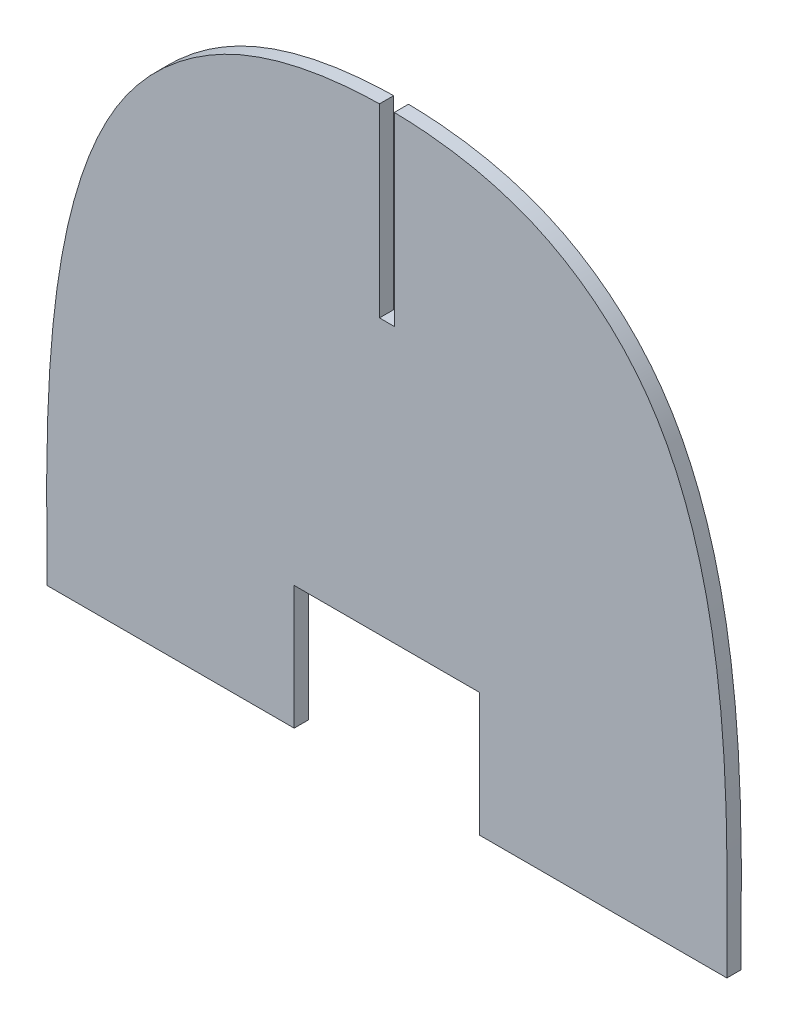
ISO-10303-21;
HEADER;
FILE_DESCRIPTION(('STEP AP214'),'2;1');
FILE_NAME('part.step','',(''),(''),'','','');
FILE_SCHEMA(('AUTOMOTIVE_DESIGN { 1 0 10303 214 1 1 1 1 }'));
ENDSEC;
DATA;
#1=APPLICATION_CONTEXT('core data for automotive mechanical design processes');
#2=APPLICATION_PROTOCOL_DEFINITION('international standard','automotive_design',2000,#1);
#3=PRODUCT_CONTEXT('',#1,'mechanical');
#4=PRODUCT('Part','Part','',(#3));
#5=PRODUCT_RELATED_PRODUCT_CATEGORY('part','',(#4));
#6=PRODUCT_DEFINITION_FORMATION('','',#4);
#7=PRODUCT_DEFINITION_CONTEXT('part definition',#1,'design');
#8=PRODUCT_DEFINITION('design','',#6,#7);
#9=PRODUCT_DEFINITION_SHAPE('','',#8);
#10=(LENGTH_UNIT() NAMED_UNIT(*) SI_UNIT(.MILLI.,.METRE.));
#11=(NAMED_UNIT(*) PLANE_ANGLE_UNIT() SI_UNIT($,.RADIAN.));
#12=(NAMED_UNIT(*) SI_UNIT($,.STERADIAN.) SOLID_ANGLE_UNIT());
#13=UNCERTAINTY_MEASURE_WITH_UNIT(LENGTH_MEASURE(1.E-05),#10,'distance_accuracy_value','');
#14=(GEOMETRIC_REPRESENTATION_CONTEXT(3) GLOBAL_UNCERTAINTY_ASSIGNED_CONTEXT((#13)) GLOBAL_UNIT_ASSIGNED_CONTEXT((#10,
#11,#12)) REPRESENTATION_CONTEXT('',''));
#15=CARTESIAN_POINT('',(0.,0.,0.));
#16=DIRECTION('',(0.,0.,1.));
#17=DIRECTION('',(1.,0.,0.));
#18=AXIS2_PLACEMENT_3D('',#15,#16,#17);
#19=CARTESIAN_POINT('',(139.7,39.6875,5.842));
#20=CARTESIAN_POINT('',(139.7,82.9965852670733,5.842));
#21=CARTESIAN_POINT('',(142.840222691212,163.904467186609,5.842));
#22=CARTESIAN_POINT('',(104.060068028556,240.096596199031,5.842));
#23=CARTESIAN_POINT('',(60.712106624686,273.845268019154,5.842));
#24=CARTESIAN_POINT('',(19.7787529671966,279.4,5.842));
#25=CARTESIAN_POINT('',(0.,279.4,5.842));
#26=B_SPLINE_CURVE_WITH_KNOTS('',3,(#19,#20,#21,#22,#23,#24,#25),.UNSPECIFIED.,.F.,.F.,(4,1,1,1,
4),(0.,0.502836743683405,0.632798024999843,0.805339170019215,1.),.UNSPECIFIED.);
#27=DIRECTION('',(0.,0.,-1.));
#28=VECTOR('',#27,1.);
#29=SURFACE_OF_LINEAR_EXTRUSION('',#26,#28);
#30=CARTESIAN_POINT('',(139.7,39.6875,0.));
#31=CARTESIAN_POINT('',(139.7,82.9965852670733,0.));
#32=CARTESIAN_POINT('',(142.840222691212,163.904467186609,0.));
#33=CARTESIAN_POINT('',(104.060068028556,240.096596199031,0.));
#34=CARTESIAN_POINT('',(60.712106624686,273.845268019154,0.));
#35=CARTESIAN_POINT('',(19.7787529671966,279.4,0.));
#36=CARTESIAN_POINT('',(0.,279.4,0.));
#37=B_SPLINE_CURVE_WITH_KNOTS('',3,(#30,#31,#32,#33,#34,#35,#36),.UNSPECIFIED.,.F.,.F.,(4,1,1,1,
4),(0.,0.502836743683405,0.632798024999843,0.805339170019215,1.),.UNSPECIFIED.);
#38=CARTESIAN_POINT('',(139.7,39.6875,0.));
#39=VERTEX_POINT('',#38);
#40=CARTESIAN_POINT('',(3.048,279.376576543208,0.));
#41=VERTEX_POINT('',#40);
#42=EDGE_CURVE('E210',#39,#41,#37,.T.);
#43=ORIENTED_EDGE('',*,*,#42,.T.);
#44=DIRECTION('',(0.,0.,-1.));
#45=VECTOR('',#44,1.);
#46=CARTESIAN_POINT('',(3.04800000000001,279.376576543359,5.842));
#47=LINE('',#46,#45);
#48=CARTESIAN_POINT('',(3.048,279.376576543208,5.842));
#49=VERTEX_POINT('',#48);
#50=EDGE_CURVE('E223',#41,#49,#47,.F.);
#51=ORIENTED_EDGE('',*,*,#50,.T.);
#52=CARTESIAN_POINT('',(139.7,39.6875,5.842));
#53=VERTEX_POINT('',#52);
#54=EDGE_CURVE('E202',#53,#49,#26,.T.);
#55=ORIENTED_EDGE('',*,*,#54,.F.);
#56=DIRECTION('',(0.,0.,-1.));
#57=VECTOR('',#56,1.);
#58=CARTESIAN_POINT('',(139.7,39.6875,5.842));
#59=LINE('',#58,#57);
#60=EDGE_CURVE('E11',#53,#39,#59,.T.);
#61=ORIENTED_EDGE('',*,*,#60,.T.);
#62=EDGE_LOOP('',(#43,#51,#55,#61));
#63=FACE_BOUND('',#62,.T.);
#64=ADVANCED_FACE('F33',(#63),#29,.F.);
#65=CARTESIAN_POINT('',(139.7,39.6875,5.842));
#66=DIRECTION('',(0.,1.,0.));
#67=DIRECTION('',(-1.,0.,0.));
#68=AXIS2_PLACEMENT_3D('',#65,#66,#67);
#69=PLANE('',#68);
#70=DIRECTION('',(1.,0.,0.));
#71=VECTOR('',#70,1.);
#72=CARTESIAN_POINT('',(139.7,39.6875,5.842));
#73=LINE('',#72,#71);
#74=CARTESIAN_POINT('',(38.1,39.6875,5.842));
#75=VERTEX_POINT('',#74);
#76=EDGE_CURVE('E41',#75,#53,#73,.T.);
#77=ORIENTED_EDGE('',*,*,#76,.F.);
#78=DIRECTION('',(0.,0.,1.));
#79=VECTOR('',#78,1.);
#80=CARTESIAN_POINT('',(38.1,39.6875,0.));
#81=LINE('',#80,#79);
#82=CARTESIAN_POINT('',(38.1,39.6875,0.));
#83=VERTEX_POINT('',#82);
#84=EDGE_CURVE('E198',#83,#75,#81,.T.);
#85=ORIENTED_EDGE('',*,*,#84,.F.);
#86=DIRECTION('',(1.,0.,0.));
#87=VECTOR('',#86,1.);
#88=CARTESIAN_POINT('',(139.7,39.6875,0.));
#89=LINE('',#88,#87);
#90=EDGE_CURVE('E204',#83,#39,#89,.T.);
#91=ORIENTED_EDGE('',*,*,#90,.T.);
#92=ORIENTED_EDGE('',*,*,#60,.F.);
#93=EDGE_LOOP('',(#77,#85,#91,#92));
#94=FACE_BOUND('',#93,.T.);
#95=ADVANCED_FACE('F186',(#94),#69,.F.);
#96=CARTESIAN_POINT('',(123.782068252662,197.429796257502,5.842));
#97=DIRECTION('',(0.,0.,1.));
#98=DIRECTION('',(1.,0.,0.));
#99=AXIS2_PLACEMENT_3D('',#96,#97,#98);
#100=PLANE('',#99);
#101=DIRECTION('',(0.,1.,0.));
#102=VECTOR('',#101,1.);
#103=CARTESIAN_POINT('',(3.048,279.4,5.842));
#104=LINE('',#103,#102);
#105=CARTESIAN_POINT('',(3.04800000000001,203.2,5.842));
#106=VERTEX_POINT('',#105);
#107=EDGE_CURVE('E118',#106,#49,#104,.T.);
#108=ORIENTED_EDGE('',*,*,#107,.F.);
#109=DIRECTION('',(1.,0.,0.));
#110=VECTOR('',#109,1.);
#111=CARTESIAN_POINT('',(0.,203.2,5.842));
#112=LINE('',#111,#110);
#113=CARTESIAN_POINT('',(-3.04800000000001,203.2,5.842));
#114=VERTEX_POINT('',#113);
#115=EDGE_CURVE('E110',#114,#106,#112,.T.);
#116=ORIENTED_EDGE('',*,*,#115,.F.);
#117=DIRECTION('',(0.,1.,0.));
#118=VECTOR('',#117,1.);
#119=CARTESIAN_POINT('',(-3.048,279.4,5.842));
#120=LINE('',#119,#118);
#121=CARTESIAN_POINT('',(-3.048,279.376576543208,5.842));
#122=VERTEX_POINT('',#121);
#123=EDGE_CURVE('E115',#114,#122,#120,.T.);
#124=ORIENTED_EDGE('',*,*,#123,.T.);
#125=CARTESIAN_POINT('',(-139.7,39.6875,5.842));
#126=CARTESIAN_POINT('',(-139.7,82.9965852670733,5.842));
#127=CARTESIAN_POINT('',(-142.840222691212,163.904467186609,5.842));
#128=CARTESIAN_POINT('',(-104.060068028556,240.096596199031,5.842));
#129=CARTESIAN_POINT('',(-60.712106624686,273.845268019154,5.842));
#130=CARTESIAN_POINT('',(-19.7787529671966,279.4,5.842));
#131=CARTESIAN_POINT('',(0.,279.4,5.842));
#132=B_SPLINE_CURVE_WITH_KNOTS('',3,(#125,#126,#127,#128,#129,#130,#131),.UNSPECIFIED.,.F.,.F.,
(4,1,1,1,4),(0.,0.502836743683405,0.632798024999843,0.805339170019215,1.),.UNSPECIFIED.);
#133=CARTESIAN_POINT('',(-139.7,39.6875,5.842));
#134=VERTEX_POINT('',#133);
#135=EDGE_CURVE('E152',#134,#122,#132,.T.);
#136=ORIENTED_EDGE('',*,*,#135,.F.);
#137=DIRECTION('',(-1.,0.,0.));
#138=VECTOR('',#137,1.);
#139=CARTESIAN_POINT('',(-139.7,39.6875,5.842));
#140=LINE('',#139,#138);
#141=CARTESIAN_POINT('',(-38.1,39.6875,5.842));
#142=VERTEX_POINT('',#141);
#143=EDGE_CURVE('E157',#142,#134,#140,.T.);
#144=ORIENTED_EDGE('',*,*,#143,.F.);
#145=DIRECTION('',(0.,1.,0.));
#146=VECTOR('',#145,1.);
#147=CARTESIAN_POINT('',(-38.1,39.6875,5.842));
#148=LINE('',#147,#146);
#149=CARTESIAN_POINT('',(-38.1,90.4875,5.842));
#150=VERTEX_POINT('',#149);
#151=EDGE_CURVE('E139',#142,#150,#148,.T.);
#152=ORIENTED_EDGE('',*,*,#151,.T.);
#153=DIRECTION('',(-1.,0.,0.));
#154=VECTOR('',#153,1.);
#155=CARTESIAN_POINT('',(0.,90.4875,5.842));
#156=LINE('',#155,#154);
#157=CARTESIAN_POINT('',(38.1,90.4875,5.842));
#158=VERTEX_POINT('',#157);
#159=EDGE_CURVE('E233',#158,#150,#156,.T.);
#160=ORIENTED_EDGE('',*,*,#159,.F.);
#161=DIRECTION('',(0.,1.,0.));
#162=VECTOR('',#161,1.);
#163=CARTESIAN_POINT('',(38.1,39.6875,5.842));
#164=LINE('',#163,#162);
#165=EDGE_CURVE('E230',#75,#158,#164,.T.);
#166=ORIENTED_EDGE('',*,*,#165,.F.);
#167=ORIENTED_EDGE('',*,*,#76,.T.);
#168=ORIENTED_EDGE('',*,*,#54,.T.);
#169=EDGE_LOOP('',(#108,#116,#124,#136,#144,#152,#160,#166,#167,#168));
#170=FACE_BOUND('',#169,.T.);
#171=ADVANCED_FACE('F112',(#170),#100,.T.);
#172=CARTESIAN_POINT('',(123.782068252662,197.429796257502,0.));
#173=DIRECTION('',(0.,0.,1.));
#174=DIRECTION('',(1.,0.,0.));
#175=AXIS2_PLACEMENT_3D('',#172,#173,#174);
#176=PLANE('',#175);
#177=DIRECTION('',(1.,0.,0.));
#178=VECTOR('',#177,1.);
#179=CARTESIAN_POINT('',(0.,203.2,0.));
#180=LINE('',#179,#178);
#181=CARTESIAN_POINT('',(-3.04800000000001,203.2,0.));
#182=VERTEX_POINT('',#181);
#183=CARTESIAN_POINT('',(3.04800000000001,203.2,0.));
#184=VERTEX_POINT('',#183);
#185=EDGE_CURVE('E126',#182,#184,#180,.T.);
#186=ORIENTED_EDGE('',*,*,#185,.T.);
#187=DIRECTION('',(0.,1.,0.));
#188=VECTOR('',#187,1.);
#189=CARTESIAN_POINT('',(3.048,279.4,0.));
#190=LINE('',#189,#188);
#191=EDGE_CURVE('E48',#184,#41,#190,.T.);
#192=ORIENTED_EDGE('',*,*,#191,.T.);
#193=ORIENTED_EDGE('',*,*,#42,.F.);
#194=ORIENTED_EDGE('',*,*,#90,.F.);
#195=DIRECTION('',(0.,1.,0.));
#196=VECTOR('',#195,1.);
#197=CARTESIAN_POINT('',(38.1,39.6875,0.));
#198=LINE('',#197,#196);
#199=CARTESIAN_POINT('',(38.1,90.4875,0.));
#200=VERTEX_POINT('',#199);
#201=EDGE_CURVE('E231',#83,#200,#198,.T.);
#202=ORIENTED_EDGE('',*,*,#201,.T.);
#203=DIRECTION('',(-1.,0.,0.));
#204=VECTOR('',#203,1.);
#205=CARTESIAN_POINT('',(0.,90.4875,0.));
#206=LINE('',#205,#204);
#207=CARTESIAN_POINT('',(-38.1,90.4875,0.));
#208=VERTEX_POINT('',#207);
#209=EDGE_CURVE('E56',#200,#208,#206,.T.);
#210=ORIENTED_EDGE('',*,*,#209,.T.);
#211=DIRECTION('',(0.,1.,0.));
#212=VECTOR('',#211,1.);
#213=CARTESIAN_POINT('',(-38.1,39.6875,0.));
#214=LINE('',#213,#212);
#215=CARTESIAN_POINT('',(-38.1,39.6875,0.));
#216=VERTEX_POINT('',#215);
#217=EDGE_CURVE('E140',#216,#208,#214,.T.);
#218=ORIENTED_EDGE('',*,*,#217,.F.);
#219=DIRECTION('',(-1.,0.,0.));
#220=VECTOR('',#219,1.);
#221=CARTESIAN_POINT('',(-139.7,39.6875,0.));
#222=LINE('',#221,#220);
#223=CARTESIAN_POINT('',(-139.7,39.6875,0.));
#224=VERTEX_POINT('',#223);
#225=EDGE_CURVE('E158',#216,#224,#222,.T.);
#226=ORIENTED_EDGE('',*,*,#225,.T.);
#227=CARTESIAN_POINT('',(-139.7,39.6875,0.));
#228=CARTESIAN_POINT('',(-139.7,82.9965852670733,0.));
#229=CARTESIAN_POINT('',(-142.840222691212,163.904467186609,0.));
#230=CARTESIAN_POINT('',(-104.060068028556,240.096596199031,0.));
#231=CARTESIAN_POINT('',(-60.712106624686,273.845268019154,0.));
#232=CARTESIAN_POINT('',(-19.7787529671966,279.4,0.));
#233=CARTESIAN_POINT('',(0.,279.4,0.));
#234=B_SPLINE_CURVE_WITH_KNOTS('',3,(#227,#228,#229,#230,#231,#232,#233),.UNSPECIFIED.,.F.,.F.,
(4,1,1,1,4),(0.,0.502836743683405,0.632798024999843,0.805339170019215,1.),.UNSPECIFIED.);
#235=CARTESIAN_POINT('',(-3.048,279.376576543208,0.));
#236=VERTEX_POINT('',#235);
#237=EDGE_CURVE('E149',#224,#236,#234,.T.);
#238=ORIENTED_EDGE('',*,*,#237,.T.);
#239=DIRECTION('',(0.,1.,0.));
#240=VECTOR('',#239,1.);
#241=CARTESIAN_POINT('',(-3.048,279.4,0.));
#242=LINE('',#241,#240);
#243=EDGE_CURVE('E130',#182,#236,#242,.T.);
#244=ORIENTED_EDGE('',*,*,#243,.F.);
#245=EDGE_LOOP('',(#186,#192,#193,#194,#202,#210,#218,#226,#238,#244));
#246=FACE_BOUND('',#245,.T.);
#247=ADVANCED_FACE('F180',(#246),#176,.F.);
#248=CARTESIAN_POINT('',(0.,90.4875,0.));
#249=DIRECTION('',(0.,1.,0.));
#250=DIRECTION('',(0.,0.,1.));
#251=AXIS2_PLACEMENT_3D('',#248,#249,#250);
#252=PLANE('',#251);
#253=ORIENTED_EDGE('',*,*,#159,.T.);
#254=DIRECTION('',(0.,0.,1.));
#255=VECTOR('',#254,1.);
#256=CARTESIAN_POINT('',(-38.1,90.4875,0.));
#257=LINE('',#256,#255);
#258=EDGE_CURVE('E146',#208,#150,#257,.T.);
#259=ORIENTED_EDGE('',*,*,#258,.F.);
#260=ORIENTED_EDGE('',*,*,#209,.F.);
#261=DIRECTION('',(0.,0.,1.));
#262=VECTOR('',#261,1.);
#263=CARTESIAN_POINT('',(38.1,90.4875,0.));
#264=LINE('',#263,#262);
#265=EDGE_CURVE('E214',#200,#158,#264,.T.);
#266=ORIENTED_EDGE('',*,*,#265,.T.);
#267=EDGE_LOOP('',(#253,#259,#260,#266));
#268=FACE_BOUND('',#267,.T.);
#269=ADVANCED_FACE('F177',(#268),#252,.F.);
#270=CARTESIAN_POINT('',(38.1,39.6875,0.));
#271=DIRECTION('',(1.,0.,0.));
#272=DIRECTION('',(0.,0.,-1.));
#273=AXIS2_PLACEMENT_3D('',#270,#271,#272);
#274=PLANE('',#273);
#275=ORIENTED_EDGE('',*,*,#165,.T.);
#276=ORIENTED_EDGE('',*,*,#265,.F.);
#277=ORIENTED_EDGE('',*,*,#201,.F.);
#278=ORIENTED_EDGE('',*,*,#84,.T.);
#279=EDGE_LOOP('',(#275,#276,#277,#278));
#280=FACE_BOUND('',#279,.T.);
#281=ADVANCED_FACE('F174',(#280),#274,.F.);
#282=CARTESIAN_POINT('',(3.048,279.4,0.));
#283=DIRECTION('',(1.,0.,0.));
#284=DIRECTION('',(0.,1.,0.));
#285=AXIS2_PLACEMENT_3D('',#282,#283,#284);
#286=PLANE('',#285);
#287=ORIENTED_EDGE('',*,*,#191,.F.);
#288=DIRECTION('',(0.,0.,1.));
#289=VECTOR('',#288,1.);
#290=CARTESIAN_POINT('',(3.04800000000001,203.2,0.));
#291=LINE('',#290,#289);
#292=EDGE_CURVE('E221',#184,#106,#291,.T.);
#293=ORIENTED_EDGE('',*,*,#292,.T.);
#294=ORIENTED_EDGE('',*,*,#107,.T.);
#295=ORIENTED_EDGE('',*,*,#50,.F.);
#296=EDGE_LOOP('',(#287,#293,#294,#295));
#297=FACE_BOUND('',#296,.T.);
#298=ADVANCED_FACE('F171',(#297),#286,.F.);
#299=CARTESIAN_POINT('',(0.,203.2,0.));
#300=DIRECTION('',(0.,-1.,0.));
#301=DIRECTION('',(0.,0.,-1.));
#302=AXIS2_PLACEMENT_3D('',#299,#300,#301);
#303=PLANE('',#302);
#304=ORIENTED_EDGE('',*,*,#115,.T.);
#305=ORIENTED_EDGE('',*,*,#292,.F.);
#306=ORIENTED_EDGE('',*,*,#185,.F.);
#307=DIRECTION('',(0.,0.,1.));
#308=VECTOR('',#307,1.);
#309=CARTESIAN_POINT('',(-3.04800000000001,203.2,0.));
#310=LINE('',#309,#308);
#311=EDGE_CURVE('E123',#182,#114,#310,.T.);
#312=ORIENTED_EDGE('',*,*,#311,.T.);
#313=EDGE_LOOP('',(#304,#305,#306,#312));
#314=FACE_BOUND('',#313,.T.);
#315=ADVANCED_FACE('F124',(#314),#303,.F.);
#316=DIRECTION('',(0.,0.,-1.));
#317=VECTOR('',#316,1.);
#318=SURFACE_OF_LINEAR_EXTRUSION('',#132,#317);
#319=ORIENTED_EDGE('',*,*,#237,.F.);
#320=DIRECTION('',(0.,0.,-1.));
#321=VECTOR('',#320,1.);
#322=CARTESIAN_POINT('',(-139.7,39.6875,5.842));
#323=LINE('',#322,#321);
#324=EDGE_CURVE('E120',#134,#224,#323,.T.);
#325=ORIENTED_EDGE('',*,*,#324,.F.);
#326=ORIENTED_EDGE('',*,*,#135,.T.);
#327=DIRECTION('',(0.,0.,-1.));
#328=VECTOR('',#327,1.);
#329=CARTESIAN_POINT('',(-3.04800000000001,279.376576543359,5.842));
#330=LINE('',#329,#328);
#331=EDGE_CURVE('E129',#236,#122,#330,.F.);
#332=ORIENTED_EDGE('',*,*,#331,.F.);
#333=EDGE_LOOP('',(#319,#325,#326,#332));
#334=FACE_BOUND('',#333,.T.);
#335=ADVANCED_FACE('F164',(#334),#318,.T.);
#336=CARTESIAN_POINT('',(-139.7,39.6875,5.842));
#337=DIRECTION('',(0.,1.,0.));
#338=DIRECTION('',(1.,0.,0.));
#339=AXIS2_PLACEMENT_3D('',#336,#337,#338);
#340=PLANE('',#339);
#341=ORIENTED_EDGE('',*,*,#143,.T.);
#342=ORIENTED_EDGE('',*,*,#324,.T.);
#343=ORIENTED_EDGE('',*,*,#225,.F.);
#344=DIRECTION('',(0.,0.,1.));
#345=VECTOR('',#344,1.);
#346=CARTESIAN_POINT('',(-38.1,39.6875,0.));
#347=LINE('',#346,#345);
#348=EDGE_CURVE('E143',#216,#142,#347,.T.);
#349=ORIENTED_EDGE('',*,*,#348,.T.);
#350=EDGE_LOOP('',(#341,#342,#343,#349));
#351=FACE_BOUND('',#350,.T.);
#352=ADVANCED_FACE('F168',(#351),#340,.F.);
#353=CARTESIAN_POINT('',(-38.1,39.6875,0.));
#354=DIRECTION('',(-1.,0.,0.));
#355=DIRECTION('',(0.,0.,-1.));
#356=AXIS2_PLACEMENT_3D('',#353,#354,#355);
#357=PLANE('',#356);
#358=ORIENTED_EDGE('',*,*,#151,.F.);
#359=ORIENTED_EDGE('',*,*,#348,.F.);
#360=ORIENTED_EDGE('',*,*,#217,.T.);
#361=ORIENTED_EDGE('',*,*,#258,.T.);
#362=EDGE_LOOP('',(#358,#359,#360,#361));
#363=FACE_BOUND('',#362,.T.);
#364=ADVANCED_FACE('F241',(#363),#357,.F.);
#365=CARTESIAN_POINT('',(-3.048,279.4,0.));
#366=DIRECTION('',(-1.,0.,0.));
#367=DIRECTION('',(0.,1.,0.));
#368=AXIS2_PLACEMENT_3D('',#365,#366,#367);
#369=PLANE('',#368);
#370=ORIENTED_EDGE('',*,*,#243,.T.);
#371=ORIENTED_EDGE('',*,*,#331,.T.);
#372=ORIENTED_EDGE('',*,*,#123,.F.);
#373=ORIENTED_EDGE('',*,*,#311,.F.);
#374=EDGE_LOOP('',(#370,#371,#372,#373));
#375=FACE_BOUND('',#374,.T.);
#376=ADVANCED_FACE('F132',(#375),#369,.F.);
#377=CLOSED_SHELL('',(#64,#95,#171,#247,#269,#281,#298,#315,#335,#352,#364,#376));
#378=MANIFOLD_SOLID_BREP('B2',#377);
#379=ADVANCED_BREP_SHAPE_REPRESENTATION('',(#18,#378),#14);
#380=SHAPE_DEFINITION_REPRESENTATION(#9,#379);
ENDSEC;
END-ISO-10303-21;
